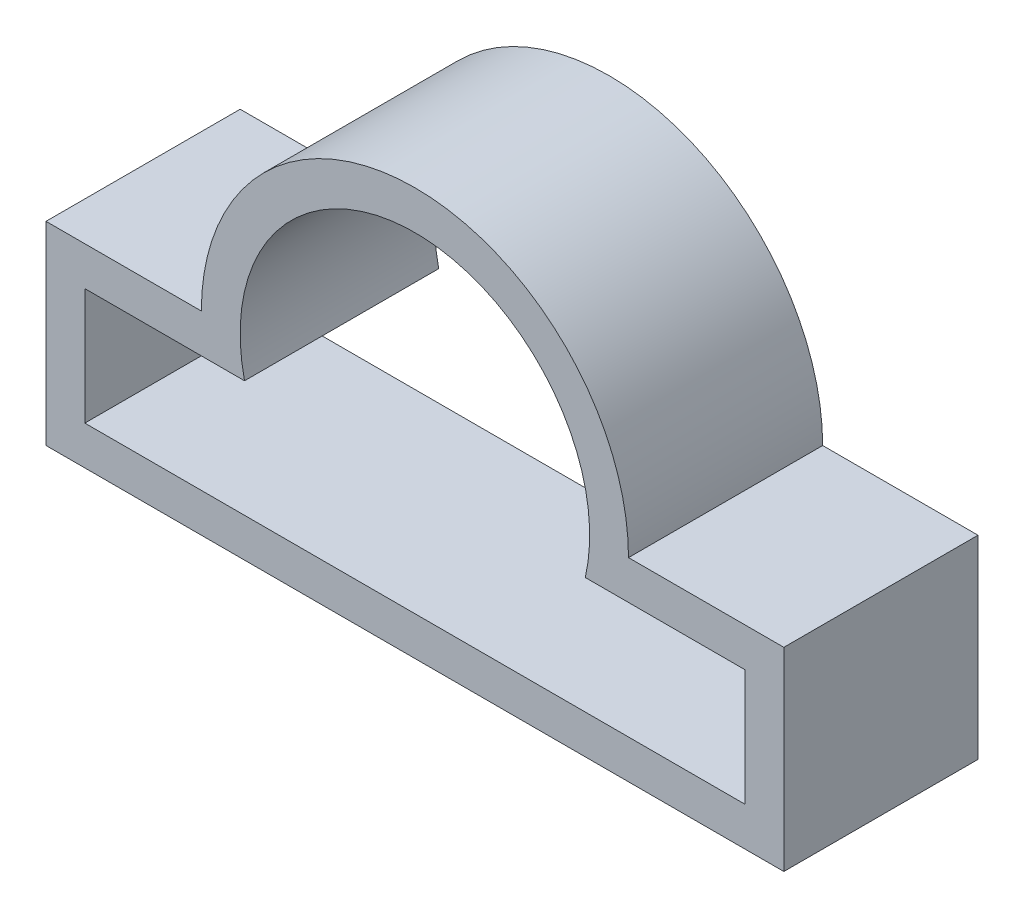
ISO-10303-21;
HEADER;
FILE_DESCRIPTION(('STEP AP214'),'2;1');
FILE_NAME('part.step','',(''),(''),'','','');
FILE_SCHEMA(('AUTOMOTIVE_DESIGN { 1 0 10303 214 1 1 1 1 }'));
ENDSEC;
DATA;
#1=APPLICATION_CONTEXT('core data for automotive mechanical design processes');
#2=APPLICATION_PROTOCOL_DEFINITION('international standard','automotive_design',2000,#1);
#3=PRODUCT_CONTEXT('',#1,'mechanical');
#4=PRODUCT('Part','Part','',(#3));
#5=PRODUCT_RELATED_PRODUCT_CATEGORY('part','',(#4));
#6=PRODUCT_DEFINITION_FORMATION('','',#4);
#7=PRODUCT_DEFINITION_CONTEXT('part definition',#1,'design');
#8=PRODUCT_DEFINITION('design','',#6,#7);
#9=PRODUCT_DEFINITION_SHAPE('','',#8);
#10=(LENGTH_UNIT() NAMED_UNIT(*) SI_UNIT(.MILLI.,.METRE.));
#11=(NAMED_UNIT(*) PLANE_ANGLE_UNIT() SI_UNIT($,.RADIAN.));
#12=(NAMED_UNIT(*) SI_UNIT($,.STERADIAN.) SOLID_ANGLE_UNIT());
#13=UNCERTAINTY_MEASURE_WITH_UNIT(LENGTH_MEASURE(1.E-05),#10,'distance_accuracy_value','');
#14=(GEOMETRIC_REPRESENTATION_CONTEXT(3) GLOBAL_UNCERTAINTY_ASSIGNED_CONTEXT((#13)) GLOBAL_UNIT_ASSIGNED_CONTEXT((#10,
#11,#12)) REPRESENTATION_CONTEXT('',''));
#15=CARTESIAN_POINT('',(0.,0.,0.));
#16=DIRECTION('',(0.,0.,1.));
#17=DIRECTION('',(1.,0.,0.));
#18=AXIS2_PLACEMENT_3D('',#15,#16,#17);
#19=CARTESIAN_POINT('',(0.,9.99999999999999,10.));
#20=DIRECTION('',(0.,0.,1.));
#21=DIRECTION('',(1.,0.,0.));
#22=AXIS2_PLACEMENT_3D('',#19,#20,#21);
#23=PLANE('',#22);
#24=DIRECTION('',(0.,1.,0.));
#25=VECTOR('',#24,1.);
#26=CARTESIAN_POINT('',(19.,10.,10.));
#27=LINE('',#26,#25);
#28=CARTESIAN_POINT('',(19.,0.,10.));
#29=VERTEX_POINT('',#28);
#30=CARTESIAN_POINT('',(19.,10.,10.));
#31=VERTEX_POINT('',#30);
#32=EDGE_CURVE('E213',#29,#31,#27,.T.);
#33=ORIENTED_EDGE('',*,*,#32,.T.);
#34=DIRECTION('',(-1.,0.,0.));
#35=VECTOR('',#34,1.);
#36=CARTESIAN_POINT('',(11.,10.,10.));
#37=LINE('',#36,#35);
#38=CARTESIAN_POINT('',(11.,10.,10.));
#39=VERTEX_POINT('',#38);
#40=EDGE_CURVE('E216',#31,#39,#37,.T.);
#41=ORIENTED_EDGE('',*,*,#40,.T.);
#42=CARTESIAN_POINT('',(0.,9.99999999999999,10.));
#43=DIRECTION('',(0.,0.,1.));
#44=DIRECTION('',(-1.,0.,0.));
#45=AXIS2_PLACEMENT_3D('',#42,#43,#44);
#46=CIRCLE('',#45,11.);
#47=CARTESIAN_POINT('',(-11.,9.99999999999999,10.));
#48=VERTEX_POINT('',#47);
#49=EDGE_CURVE('E219',#39,#48,#46,.T.);
#50=ORIENTED_EDGE('',*,*,#49,.T.);
#51=DIRECTION('',(-1.,0.,0.));
#52=VECTOR('',#51,1.);
#53=CARTESIAN_POINT('',(-19.,9.99999999999999,10.));
#54=LINE('',#53,#52);
#55=CARTESIAN_POINT('',(-19.,9.99999999999999,10.));
#56=VERTEX_POINT('',#55);
#57=EDGE_CURVE('E221',#48,#56,#54,.T.);
#58=ORIENTED_EDGE('',*,*,#57,.T.);
#59=DIRECTION('',(0.,-1.,0.));
#60=VECTOR('',#59,1.);
#61=CARTESIAN_POINT('',(-19.,0.,10.));
#62=LINE('',#61,#60);
#63=CARTESIAN_POINT('',(-19.,0.,10.));
#64=VERTEX_POINT('',#63);
#65=EDGE_CURVE('E223',#56,#64,#62,.T.);
#66=ORIENTED_EDGE('',*,*,#65,.T.);
#67=DIRECTION('',(1.,0.,0.));
#68=VECTOR('',#67,1.);
#69=CARTESIAN_POINT('',(19.,0.,10.));
#70=LINE('',#69,#68);
#71=EDGE_CURVE('E225',#64,#29,#70,.T.);
#72=ORIENTED_EDGE('',*,*,#71,.T.);
#73=EDGE_LOOP('',(#33,#41,#50,#58,#66,#72));
#74=FACE_BOUND('',#73,.T.);
#75=DIRECTION('',(-1.,0.,0.));
#76=VECTOR('',#75,1.);
#77=CARTESIAN_POINT('',(0.,7.99999999999999,10.));
#78=LINE('',#77,#76);
#79=CARTESIAN_POINT('',(17.,8.00000000000001,10.));
#80=VERTEX_POINT('',#79);
#81=CARTESIAN_POINT('',(8.77496438739212,8.,10.));
#82=VERTEX_POINT('',#81);
#83=EDGE_CURVE('E170',#80,#82,#78,.T.);
#84=ORIENTED_EDGE('',*,*,#83,.F.);
#85=DIRECTION('',(0.,1.,0.));
#86=VECTOR('',#85,1.);
#87=CARTESIAN_POINT('',(17.,10.,10.));
#88=LINE('',#87,#86);
#89=CARTESIAN_POINT('',(17.,2.00000000000001,10.));
#90=VERTEX_POINT('',#89);
#91=EDGE_CURVE('E162',#90,#80,#88,.T.);
#92=ORIENTED_EDGE('',*,*,#91,.F.);
#93=DIRECTION('',(1.,0.,0.));
#94=VECTOR('',#93,1.);
#95=CARTESIAN_POINT('',(0.,2.,10.));
#96=LINE('',#95,#94);
#97=CARTESIAN_POINT('',(-17.,2.,10.));
#98=VERTEX_POINT('',#97);
#99=EDGE_CURVE('E191',#98,#90,#96,.T.);
#100=ORIENTED_EDGE('',*,*,#99,.F.);
#101=DIRECTION('',(0.,-1.,0.));
#102=VECTOR('',#101,1.);
#103=CARTESIAN_POINT('',(-17.,10.,10.));
#104=LINE('',#103,#102);
#105=CARTESIAN_POINT('',(-17.,7.99999999999999,10.));
#106=VERTEX_POINT('',#105);
#107=EDGE_CURVE('E189',#106,#98,#104,.T.);
#108=ORIENTED_EDGE('',*,*,#107,.F.);
#109=DIRECTION('',(-1.,0.,0.));
#110=VECTOR('',#109,1.);
#111=CARTESIAN_POINT('',(0.,7.99999999999999,10.));
#112=LINE('',#111,#110);
#113=CARTESIAN_POINT('',(-8.77496438739212,7.99999999999999,10.));
#114=VERTEX_POINT('',#113);
#115=EDGE_CURVE('E185',#114,#106,#112,.T.);
#116=ORIENTED_EDGE('',*,*,#115,.F.);
#117=CARTESIAN_POINT('',(0.,9.99999999999999,10.));
#118=DIRECTION('',(0.,0.,-1.));
#119=DIRECTION('',(-1.,0.,0.));
#120=AXIS2_PLACEMENT_3D('',#117,#118,#119);
#121=CIRCLE('',#120,9.);
#122=EDGE_CURVE('E183',#82,#114,#121,.F.);
#123=ORIENTED_EDGE('',*,*,#122,.F.);
#124=EDGE_LOOP('',(#84,#92,#100,#108,#116,#123));
#125=FACE_BOUND('',#124,.T.);
#126=ADVANCED_FACE('F73',(#74,#125),#23,.T.);
#127=CARTESIAN_POINT('',(0.,9.99999999999999,0.));
#128=DIRECTION('',(0.,0.,1.));
#129=DIRECTION('',(1.,0.,0.));
#130=AXIS2_PLACEMENT_3D('',#127,#128,#129);
#131=PLANE('',#130);
#132=DIRECTION('',(0.,1.,0.));
#133=VECTOR('',#132,1.);
#134=CARTESIAN_POINT('',(19.,10.,0.));
#135=LINE('',#134,#133);
#136=CARTESIAN_POINT('',(19.,0.,0.));
#137=VERTEX_POINT('',#136);
#138=CARTESIAN_POINT('',(19.,10.,0.));
#139=VERTEX_POINT('',#138);
#140=EDGE_CURVE('E178',#137,#139,#135,.T.);
#141=ORIENTED_EDGE('',*,*,#140,.F.);
#142=DIRECTION('',(1.,0.,0.));
#143=VECTOR('',#142,1.);
#144=CARTESIAN_POINT('',(19.,0.,0.));
#145=LINE('',#144,#143);
#146=CARTESIAN_POINT('',(-19.,0.,0.));
#147=VERTEX_POINT('',#146);
#148=EDGE_CURVE('E217',#147,#137,#145,.T.);
#149=ORIENTED_EDGE('',*,*,#148,.F.);
#150=DIRECTION('',(0.,-1.,0.));
#151=VECTOR('',#150,1.);
#152=CARTESIAN_POINT('',(-19.,0.,0.));
#153=LINE('',#152,#151);
#154=CARTESIAN_POINT('',(-19.,9.99999999999999,0.));
#155=VERTEX_POINT('',#154);
#156=EDGE_CURVE('E236',#155,#147,#153,.T.);
#157=ORIENTED_EDGE('',*,*,#156,.F.);
#158=DIRECTION('',(-1.,0.,0.));
#159=VECTOR('',#158,1.);
#160=CARTESIAN_POINT('',(-19.,9.99999999999999,0.));
#161=LINE('',#160,#159);
#162=CARTESIAN_POINT('',(-11.,9.99999999999999,0.));
#163=VERTEX_POINT('',#162);
#164=EDGE_CURVE('E234',#163,#155,#161,.T.);
#165=ORIENTED_EDGE('',*,*,#164,.F.);
#166=CARTESIAN_POINT('',(0.,9.99999999999999,0.));
#167=DIRECTION('',(0.,0.,1.));
#168=DIRECTION('',(-1.,0.,0.));
#169=AXIS2_PLACEMENT_3D('',#166,#167,#168);
#170=CIRCLE('',#169,11.);
#171=CARTESIAN_POINT('',(11.,10.,0.));
#172=VERTEX_POINT('',#171);
#173=EDGE_CURVE('E232',#172,#163,#170,.T.);
#174=ORIENTED_EDGE('',*,*,#173,.F.);
#175=DIRECTION('',(-1.,0.,0.));
#176=VECTOR('',#175,1.);
#177=CARTESIAN_POINT('',(11.,10.,0.));
#178=LINE('',#177,#176);
#179=EDGE_CURVE('E230',#139,#172,#178,.T.);
#180=ORIENTED_EDGE('',*,*,#179,.F.);
#181=EDGE_LOOP('',(#141,#149,#157,#165,#174,#180));
#182=FACE_BOUND('',#181,.T.);
#183=DIRECTION('',(0.,1.,0.));
#184=VECTOR('',#183,1.);
#185=CARTESIAN_POINT('',(17.,10.,0.));
#186=LINE('',#185,#184);
#187=CARTESIAN_POINT('',(17.,2.00000000000001,0.));
#188=VERTEX_POINT('',#187);
#189=CARTESIAN_POINT('',(17.,8.00000000000001,0.));
#190=VERTEX_POINT('',#189);
#191=EDGE_CURVE('E96',#188,#190,#186,.T.);
#192=ORIENTED_EDGE('',*,*,#191,.T.);
#193=DIRECTION('',(-1.,0.,0.));
#194=VECTOR('',#193,1.);
#195=CARTESIAN_POINT('',(0.,7.99999999999999,0.));
#196=LINE('',#195,#194);
#197=CARTESIAN_POINT('',(8.77496438739212,8.,0.));
#198=VERTEX_POINT('',#197);
#199=EDGE_CURVE('E177',#190,#198,#196,.T.);
#200=ORIENTED_EDGE('',*,*,#199,.T.);
#201=CARTESIAN_POINT('',(0.,9.99999999999999,0.));
#202=DIRECTION('',(0.,0.,-1.));
#203=DIRECTION('',(-1.,0.,0.));
#204=AXIS2_PLACEMENT_3D('',#201,#202,#203);
#205=CIRCLE('',#204,9.);
#206=CARTESIAN_POINT('',(-8.77496438739212,7.99999999999999,0.));
#207=VERTEX_POINT('',#206);
#208=EDGE_CURVE('E195',#198,#207,#205,.F.);
#209=ORIENTED_EDGE('',*,*,#208,.T.);
#210=DIRECTION('',(-1.,0.,0.));
#211=VECTOR('',#210,1.);
#212=CARTESIAN_POINT('',(0.,7.99999999999999,0.));
#213=LINE('',#212,#211);
#214=CARTESIAN_POINT('',(-17.,7.99999999999999,0.));
#215=VERTEX_POINT('',#214);
#216=EDGE_CURVE('E198',#207,#215,#213,.T.);
#217=ORIENTED_EDGE('',*,*,#216,.T.);
#218=DIRECTION('',(0.,-1.,0.));
#219=VECTOR('',#218,1.);
#220=CARTESIAN_POINT('',(-17.,10.,0.));
#221=LINE('',#220,#219);
#222=CARTESIAN_POINT('',(-17.,2.,0.));
#223=VERTEX_POINT('',#222);
#224=EDGE_CURVE('E201',#215,#223,#221,.T.);
#225=ORIENTED_EDGE('',*,*,#224,.T.);
#226=DIRECTION('',(1.,0.,0.));
#227=VECTOR('',#226,1.);
#228=CARTESIAN_POINT('',(0.,2.,0.));
#229=LINE('',#228,#227);
#230=EDGE_CURVE('E171',#223,#188,#229,.T.);
#231=ORIENTED_EDGE('',*,*,#230,.T.);
#232=EDGE_LOOP('',(#192,#200,#209,#217,#225,#231));
#233=FACE_BOUND('',#232,.T.);
#234=ADVANCED_FACE('F260',(#182,#233),#131,.F.);
#235=CARTESIAN_POINT('',(19.,10.,10.));
#236=DIRECTION('',(-1.,0.,0.));
#237=DIRECTION('',(0.,-1.,0.));
#238=AXIS2_PLACEMENT_3D('',#235,#236,#237);
#239=PLANE('',#238);
#240=ORIENTED_EDGE('',*,*,#140,.T.);
#241=DIRECTION('',(0.,0.,-1.));
#242=VECTOR('',#241,1.);
#243=CARTESIAN_POINT('',(19.,10.,10.));
#244=LINE('',#243,#242);
#245=EDGE_CURVE('E12',#31,#139,#244,.T.);
#246=ORIENTED_EDGE('',*,*,#245,.F.);
#247=ORIENTED_EDGE('',*,*,#32,.F.);
#248=DIRECTION('',(0.,0.,-1.));
#249=VECTOR('',#248,1.);
#250=CARTESIAN_POINT('',(19.,0.,10.));
#251=LINE('',#250,#249);
#252=EDGE_CURVE('E227',#29,#137,#251,.T.);
#253=ORIENTED_EDGE('',*,*,#252,.T.);
#254=EDGE_LOOP('',(#240,#246,#247,#253));
#255=FACE_BOUND('',#254,.T.);
#256=ADVANCED_FACE('F75',(#255),#239,.F.);
#257=CARTESIAN_POINT('',(11.,10.,10.));
#258=DIRECTION('',(0.,-1.,0.));
#259=DIRECTION('',(1.,0.,0.));
#260=AXIS2_PLACEMENT_3D('',#257,#258,#259);
#261=PLANE('',#260);
#262=ORIENTED_EDGE('',*,*,#179,.T.);
#263=DIRECTION('',(0.,0.,-1.));
#264=VECTOR('',#263,1.);
#265=CARTESIAN_POINT('',(11.,10.,10.));
#266=LINE('',#265,#264);
#267=EDGE_CURVE('E81',#39,#172,#266,.T.);
#268=ORIENTED_EDGE('',*,*,#267,.F.);
#269=ORIENTED_EDGE('',*,*,#40,.F.);
#270=ORIENTED_EDGE('',*,*,#245,.T.);
#271=EDGE_LOOP('',(#262,#268,#269,#270));
#272=FACE_BOUND('',#271,.T.);
#273=ADVANCED_FACE('F277',(#272),#261,.F.);
#274=CARTESIAN_POINT('',(0.,9.99999999999999,10.));
#275=DIRECTION('',(0.,0.,-1.));
#276=DIRECTION('',(-1.,0.,0.));
#277=AXIS2_PLACEMENT_3D('',#274,#275,#276);
#278=CYLINDRICAL_SURFACE('',#277,11.);
#279=ORIENTED_EDGE('',*,*,#173,.T.);
#280=DIRECTION('',(0.,0.,-1.));
#281=VECTOR('',#280,1.);
#282=CARTESIAN_POINT('',(-11.,9.99999999999999,10.));
#283=LINE('',#282,#281);
#284=EDGE_CURVE('E247',#48,#163,#283,.T.);
#285=ORIENTED_EDGE('',*,*,#284,.F.);
#286=ORIENTED_EDGE('',*,*,#49,.F.);
#287=ORIENTED_EDGE('',*,*,#267,.T.);
#288=EDGE_LOOP('',(#279,#285,#286,#287));
#289=FACE_BOUND('',#288,.T.);
#290=ADVANCED_FACE('F254',(#289),#278,.T.);
#291=CARTESIAN_POINT('',(-19.,9.99999999999999,10.));
#292=DIRECTION('',(0.,-1.,0.));
#293=DIRECTION('',(0.,0.,-1.));
#294=AXIS2_PLACEMENT_3D('',#291,#292,#293);
#295=PLANE('',#294);
#296=ORIENTED_EDGE('',*,*,#164,.T.);
#297=DIRECTION('',(0.,0.,-1.));
#298=VECTOR('',#297,1.);
#299=CARTESIAN_POINT('',(-19.,9.99999999999999,10.));
#300=LINE('',#299,#298);
#301=EDGE_CURVE('E244',#56,#155,#300,.T.);
#302=ORIENTED_EDGE('',*,*,#301,.F.);
#303=ORIENTED_EDGE('',*,*,#57,.F.);
#304=ORIENTED_EDGE('',*,*,#284,.T.);
#305=EDGE_LOOP('',(#296,#302,#303,#304));
#306=FACE_BOUND('',#305,.T.);
#307=ADVANCED_FACE('F266',(#306),#295,.F.);
#308=CARTESIAN_POINT('',(-19.,0.,10.));
#309=DIRECTION('',(1.,0.,0.));
#310=DIRECTION('',(0.,1.,0.));
#311=AXIS2_PLACEMENT_3D('',#308,#309,#310);
#312=PLANE('',#311);
#313=ORIENTED_EDGE('',*,*,#156,.T.);
#314=DIRECTION('',(0.,0.,-1.));
#315=VECTOR('',#314,1.);
#316=CARTESIAN_POINT('',(-19.,0.,10.));
#317=LINE('',#316,#315);
#318=EDGE_CURVE('E241',#64,#147,#317,.T.);
#319=ORIENTED_EDGE('',*,*,#318,.F.);
#320=ORIENTED_EDGE('',*,*,#65,.F.);
#321=ORIENTED_EDGE('',*,*,#301,.T.);
#322=EDGE_LOOP('',(#313,#319,#320,#321));
#323=FACE_BOUND('',#322,.T.);
#324=ADVANCED_FACE('F270',(#323),#312,.F.);
#325=CARTESIAN_POINT('',(19.,0.,10.));
#326=DIRECTION('',(0.,1.,0.));
#327=DIRECTION('',(-1.,0.,0.));
#328=AXIS2_PLACEMENT_3D('',#325,#326,#327);
#329=PLANE('',#328);
#330=ORIENTED_EDGE('',*,*,#148,.T.);
#331=ORIENTED_EDGE('',*,*,#252,.F.);
#332=ORIENTED_EDGE('',*,*,#71,.F.);
#333=ORIENTED_EDGE('',*,*,#318,.T.);
#334=EDGE_LOOP('',(#330,#331,#332,#333));
#335=FACE_BOUND('',#334,.T.);
#336=ADVANCED_FACE('F280',(#335),#329,.F.);
#337=CARTESIAN_POINT('',(17.,10.,10.));
#338=DIRECTION('',(-1.,0.,0.));
#339=DIRECTION('',(0.,-1.,0.));
#340=AXIS2_PLACEMENT_3D('',#337,#338,#339);
#341=PLANE('',#340);
#342=ORIENTED_EDGE('',*,*,#191,.F.);
#343=DIRECTION('',(0.,0.,-1.));
#344=VECTOR('',#343,1.);
#345=CARTESIAN_POINT('',(17.,2.00000000000001,10.));
#346=LINE('',#345,#344);
#347=EDGE_CURVE('E166',#90,#188,#346,.T.);
#348=ORIENTED_EDGE('',*,*,#347,.F.);
#349=ORIENTED_EDGE('',*,*,#91,.T.);
#350=DIRECTION('',(0.,0.,-1.));
#351=VECTOR('',#350,1.);
#352=CARTESIAN_POINT('',(17.,8.00000000000001,10.));
#353=LINE('',#352,#351);
#354=EDGE_CURVE('E165',#80,#190,#353,.T.);
#355=ORIENTED_EDGE('',*,*,#354,.T.);
#356=EDGE_LOOP('',(#342,#348,#349,#355));
#357=FACE_BOUND('',#356,.T.);
#358=ADVANCED_FACE('F164',(#357),#341,.T.);
#359=CARTESIAN_POINT('',(0.,7.99999999999999,10.));
#360=DIRECTION('',(0.,-1.,0.));
#361=DIRECTION('',(1.,0.,0.));
#362=AXIS2_PLACEMENT_3D('',#359,#360,#361);
#363=PLANE('',#362);
#364=ORIENTED_EDGE('',*,*,#199,.F.);
#365=ORIENTED_EDGE('',*,*,#354,.F.);
#366=ORIENTED_EDGE('',*,*,#83,.T.);
#367=DIRECTION('',(0.,0.,-1.));
#368=VECTOR('',#367,1.);
#369=CARTESIAN_POINT('',(8.77496438739212,8.,10.));
#370=LINE('',#369,#368);
#371=EDGE_CURVE('E179',#82,#198,#370,.T.);
#372=ORIENTED_EDGE('',*,*,#371,.T.);
#373=EDGE_LOOP('',(#364,#365,#366,#372));
#374=FACE_BOUND('',#373,.T.);
#375=ADVANCED_FACE('F174',(#374),#363,.T.);
#376=CARTESIAN_POINT('',(0.,9.99999999999999,10.));
#377=DIRECTION('',(0.,0.,-1.));
#378=DIRECTION('',(-1.,0.,0.));
#379=AXIS2_PLACEMENT_3D('',#376,#377,#378);
#380=CYLINDRICAL_SURFACE('',#379,9.);
#381=ORIENTED_EDGE('',*,*,#208,.F.);
#382=ORIENTED_EDGE('',*,*,#371,.F.);
#383=ORIENTED_EDGE('',*,*,#122,.T.);
#384=DIRECTION('',(0.,0.,-1.));
#385=VECTOR('',#384,1.);
#386=CARTESIAN_POINT('',(-8.77496438739212,7.99999999999999,10.));
#387=LINE('',#386,#385);
#388=EDGE_CURVE('E210',#114,#207,#387,.T.);
#389=ORIENTED_EDGE('',*,*,#388,.T.);
#390=EDGE_LOOP('',(#381,#382,#383,#389));
#391=FACE_BOUND('',#390,.T.);
#392=ADVANCED_FACE('F298',(#391),#380,.F.);
#393=CARTESIAN_POINT('',(0.,7.99999999999999,10.));
#394=DIRECTION('',(0.,-1.,0.));
#395=DIRECTION('',(0.,0.,-1.));
#396=AXIS2_PLACEMENT_3D('',#393,#394,#395);
#397=PLANE('',#396);
#398=ORIENTED_EDGE('',*,*,#216,.F.);
#399=ORIENTED_EDGE('',*,*,#388,.F.);
#400=ORIENTED_EDGE('',*,*,#115,.T.);
#401=DIRECTION('',(0.,0.,-1.));
#402=VECTOR('',#401,1.);
#403=CARTESIAN_POINT('',(-17.,7.99999999999999,10.));
#404=LINE('',#403,#402);
#405=EDGE_CURVE('E208',#106,#215,#404,.T.);
#406=ORIENTED_EDGE('',*,*,#405,.T.);
#407=EDGE_LOOP('',(#398,#399,#400,#406));
#408=FACE_BOUND('',#407,.T.);
#409=ADVANCED_FACE('F301',(#408),#397,.T.);
#410=CARTESIAN_POINT('',(-17.,10.,10.));
#411=DIRECTION('',(1.,0.,0.));
#412=DIRECTION('',(0.,1.,0.));
#413=AXIS2_PLACEMENT_3D('',#410,#411,#412);
#414=PLANE('',#413);
#415=ORIENTED_EDGE('',*,*,#224,.F.);
#416=ORIENTED_EDGE('',*,*,#405,.F.);
#417=ORIENTED_EDGE('',*,*,#107,.T.);
#418=DIRECTION('',(0.,0.,-1.));
#419=VECTOR('',#418,1.);
#420=CARTESIAN_POINT('',(-17.,2.,10.));
#421=LINE('',#420,#419);
#422=EDGE_CURVE('E88',#98,#223,#421,.T.);
#423=ORIENTED_EDGE('',*,*,#422,.T.);
#424=EDGE_LOOP('',(#415,#416,#417,#423));
#425=FACE_BOUND('',#424,.T.);
#426=ADVANCED_FACE('F305',(#425),#414,.T.);
#427=CARTESIAN_POINT('',(0.,2.,10.));
#428=DIRECTION('',(0.,1.,0.));
#429=DIRECTION('',(-1.,0.,0.));
#430=AXIS2_PLACEMENT_3D('',#427,#428,#429);
#431=PLANE('',#430);
#432=ORIENTED_EDGE('',*,*,#230,.F.);
#433=ORIENTED_EDGE('',*,*,#422,.F.);
#434=ORIENTED_EDGE('',*,*,#99,.T.);
#435=ORIENTED_EDGE('',*,*,#347,.T.);
#436=EDGE_LOOP('',(#432,#433,#434,#435));
#437=FACE_BOUND('',#436,.T.);
#438=ADVANCED_FACE('F309',(#437),#431,.T.);
#439=CLOSED_SHELL('',(#126,#234,#256,#273,#290,#307,#324,#336,#358,#375,#392,#409,#426,#438));
#440=MANIFOLD_SOLID_BREP('B2',#439);
#441=ADVANCED_BREP_SHAPE_REPRESENTATION('',(#18,#440),#14);
#442=SHAPE_DEFINITION_REPRESENTATION(#9,#441);
ENDSEC;
END-ISO-10303-21;
